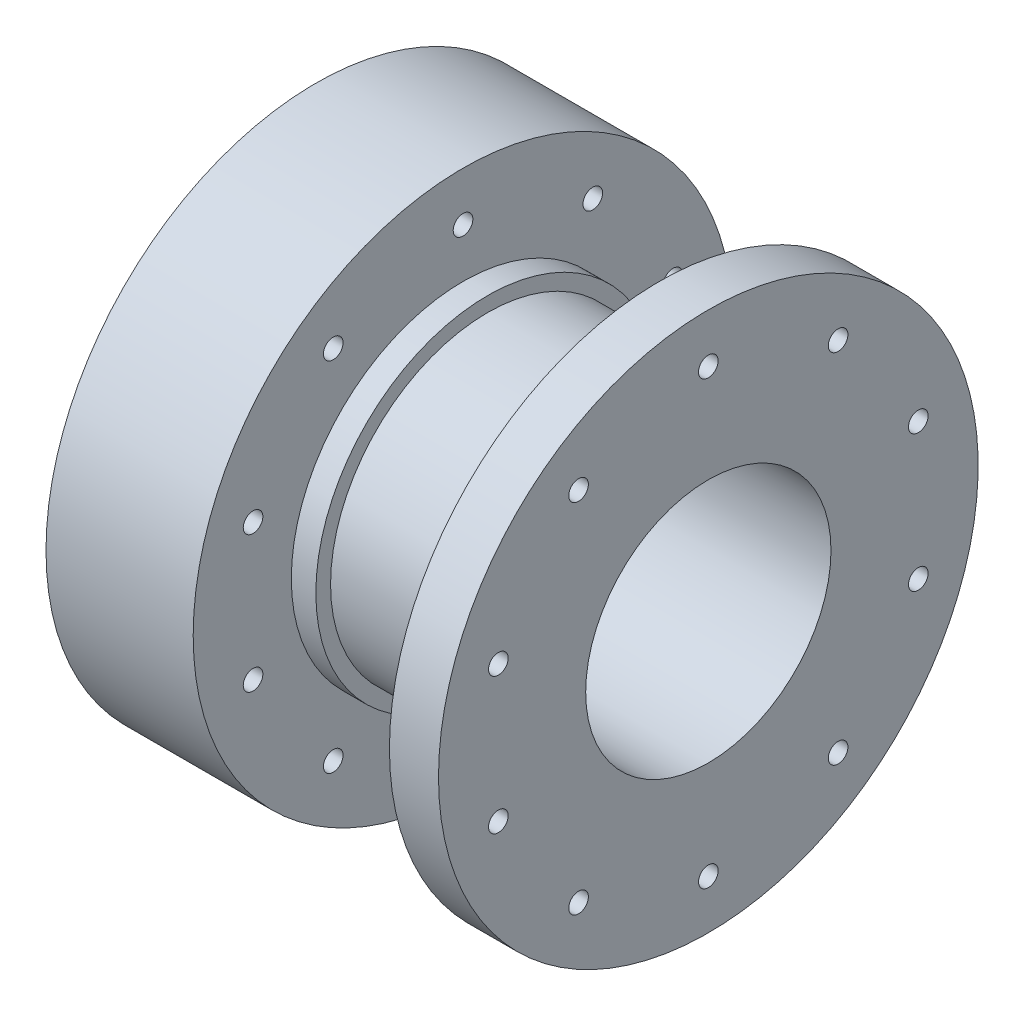
ISO-10303-21;
HEADER;
FILE_DESCRIPTION(('STEP AP214'),'2;1');
FILE_NAME('part.step','',(''),(''),'','','');
FILE_SCHEMA(('AUTOMOTIVE_DESIGN { 1 0 10303 214 1 1 1 1 }'));
ENDSEC;
DATA;
#1=APPLICATION_CONTEXT('core data for automotive mechanical design processes');
#2=APPLICATION_PROTOCOL_DEFINITION('international standard','automotive_design',2000,#1);
#3=PRODUCT_CONTEXT('',#1,'mechanical');
#4=PRODUCT('Part','Part','',(#3));
#5=PRODUCT_RELATED_PRODUCT_CATEGORY('part','',(#4));
#6=PRODUCT_DEFINITION_FORMATION('','',#4);
#7=PRODUCT_DEFINITION_CONTEXT('part definition',#1,'design');
#8=PRODUCT_DEFINITION('design','',#6,#7);
#9=PRODUCT_DEFINITION_SHAPE('','',#8);
#10=(LENGTH_UNIT() NAMED_UNIT(*) SI_UNIT(.MILLI.,.METRE.));
#11=(NAMED_UNIT(*) PLANE_ANGLE_UNIT() SI_UNIT($,.RADIAN.));
#12=(NAMED_UNIT(*) SI_UNIT($,.STERADIAN.) SOLID_ANGLE_UNIT());
#13=UNCERTAINTY_MEASURE_WITH_UNIT(LENGTH_MEASURE(1.E-05),#10,'distance_accuracy_value','');
#14=(GEOMETRIC_REPRESENTATION_CONTEXT(3) GLOBAL_UNCERTAINTY_ASSIGNED_CONTEXT((#13)) GLOBAL_UNIT_ASSIGNED_CONTEXT((#10,
#11,#12)) REPRESENTATION_CONTEXT('',''));
#15=CARTESIAN_POINT('',(0.,0.,0.));
#16=DIRECTION('',(0.,0.,1.));
#17=DIRECTION('',(1.,0.,0.));
#18=AXIS2_PLACEMENT_3D('',#15,#16,#17);
#19=CARTESIAN_POINT('',(-97.552258709785,0.,0.));
#20=DIRECTION('',(-1.,0.,0.));
#21=DIRECTION('',(0.,0.,1.));
#22=AXIS2_PLACEMENT_3D('',#19,#20,#21);
#23=CYLINDRICAL_SURFACE('',#22,40.);
#24=CARTESIAN_POINT('',(-50.,0.,0.));
#25=DIRECTION('',(-1.,0.,0.));
#26=DIRECTION('',(0.,0.,1.));
#27=AXIS2_PLACEMENT_3D('',#24,#25,#26);
#28=CIRCLE('',#27,40.);
#29=CARTESIAN_POINT('',(-50.,0.,40.));
#30=VERTEX_POINT('',#29);
#31=EDGE_CURVE('E10',#30,#30,#28,.T.);
#32=ORIENTED_EDGE('',*,*,#31,.F.);
#33=EDGE_LOOP('',(#32));
#34=FACE_BOUND('',#33,.T.);
#35=CARTESIAN_POINT('',(-30.,0.,0.));
#36=DIRECTION('',(-1.,0.,0.));
#37=DIRECTION('',(0.,0.,1.));
#38=AXIS2_PLACEMENT_3D('',#35,#36,#37);
#39=CIRCLE('',#38,40.);
#40=CARTESIAN_POINT('',(-30.,0.,40.));
#41=VERTEX_POINT('',#40);
#42=EDGE_CURVE('E117',#41,#41,#39,.T.);
#43=ORIENTED_EDGE('',*,*,#42,.T.);
#44=EDGE_LOOP('',(#43));
#45=FACE_BOUND('',#44,.T.);
#46=ADVANCED_FACE('F37',(#34,#45),#23,.T.);
#47=CARTESIAN_POINT('',(-50.,35.,0.));
#48=DIRECTION('',(1.,0.,0.));
#49=DIRECTION('',(0.,0.,-1.));
#50=AXIS2_PLACEMENT_3D('',#47,#48,#49);
#51=PLANE('',#50);
#52=CARTESIAN_POINT('',(-50.,0.,0.));
#53=DIRECTION('',(-1.,0.,0.));
#54=DIRECTION('',(0.,0.,1.));
#55=AXIS2_PLACEMENT_3D('',#52,#53,#54);
#56=CIRCLE('',#55,35.);
#57=CARTESIAN_POINT('',(-50.,0.,35.));
#58=VERTEX_POINT('',#57);
#59=EDGE_CURVE('E44',#58,#58,#56,.T.);
#60=ORIENTED_EDGE('',*,*,#59,.F.);
#61=EDGE_LOOP('',(#60));
#62=FACE_BOUND('',#61,.T.);
#63=ORIENTED_EDGE('',*,*,#31,.T.);
#64=EDGE_LOOP('',(#63));
#65=FACE_BOUND('',#64,.T.);
#66=ADVANCED_FACE('F169',(#62,#65),#51,.F.);
#67=CARTESIAN_POINT('',(-97.552258709785,0.,0.));
#68=DIRECTION('',(-1.,0.,0.));
#69=DIRECTION('',(0.,0.,1.));
#70=AXIS2_PLACEMENT_3D('',#67,#68,#69);
#71=CYLINDRICAL_SURFACE('',#70,35.);
#72=CARTESIAN_POINT('',(-30.,0.,0.));
#73=DIRECTION('',(-1.,0.,0.));
#74=DIRECTION('',(0.,0.,1.));
#75=AXIS2_PLACEMENT_3D('',#72,#73,#74);
#76=CIRCLE('',#75,35.);
#77=CARTESIAN_POINT('',(-30.,0.,35.));
#78=VERTEX_POINT('',#77);
#79=EDGE_CURVE('E49',#78,#78,#76,.T.);
#80=ORIENTED_EDGE('',*,*,#79,.F.);
#81=EDGE_LOOP('',(#80));
#82=FACE_BOUND('',#81,.T.);
#83=ORIENTED_EDGE('',*,*,#59,.T.);
#84=EDGE_LOOP('',(#83));
#85=FACE_BOUND('',#84,.T.);
#86=ADVANCED_FACE('F166',(#82,#85),#71,.F.);
#87=CARTESIAN_POINT('',(-30.,25.,0.));
#88=DIRECTION('',(1.,0.,0.));
#89=DIRECTION('',(0.,0.,-1.));
#90=AXIS2_PLACEMENT_3D('',#87,#88,#89);
#91=PLANE('',#90);
#92=CARTESIAN_POINT('',(-30.,0.,0.));
#93=DIRECTION('',(-1.,0.,0.));
#94=DIRECTION('',(0.,0.,1.));
#95=AXIS2_PLACEMENT_3D('',#92,#93,#94);
#96=CIRCLE('',#95,25.);
#97=CARTESIAN_POINT('',(-30.,0.,25.));
#98=VERTEX_POINT('',#97);
#99=EDGE_CURVE('E159',#98,#98,#96,.T.);
#100=ORIENTED_EDGE('',*,*,#99,.F.);
#101=EDGE_LOOP('',(#100));
#102=FACE_BOUND('',#101,.T.);
#103=ORIENTED_EDGE('',*,*,#79,.T.);
#104=EDGE_LOOP('',(#103));
#105=FACE_BOUND('',#104,.T.);
#106=ADVANCED_FACE('F164',(#102,#105),#91,.F.);
#107=CARTESIAN_POINT('',(-97.552258709785,0.,0.));
#108=DIRECTION('',(-1.,0.,0.));
#109=DIRECTION('',(0.,0.,1.));
#110=AXIS2_PLACEMENT_3D('',#107,#108,#109);
#111=CYLINDRICAL_SURFACE('',#110,25.);
#112=CARTESIAN_POINT('',(30.,0.,0.));
#113=DIRECTION('',(-1.,0.,0.));
#114=DIRECTION('',(0.,0.,1.));
#115=AXIS2_PLACEMENT_3D('',#112,#113,#114);
#116=CIRCLE('',#115,25.);
#117=CARTESIAN_POINT('',(30.,0.,25.));
#118=VERTEX_POINT('',#117);
#119=EDGE_CURVE('E156',#118,#118,#116,.T.);
#120=ORIENTED_EDGE('',*,*,#119,.F.);
#121=EDGE_LOOP('',(#120));
#122=FACE_BOUND('',#121,.T.);
#123=ORIENTED_EDGE('',*,*,#99,.T.);
#124=EDGE_LOOP('',(#123));
#125=FACE_BOUND('',#124,.T.);
#126=ADVANCED_FACE('F181',(#122,#125),#111,.F.);
#127=CARTESIAN_POINT('',(30.,55.,0.));
#128=DIRECTION('',(-1.,0.,0.));
#129=DIRECTION('',(0.,0.,1.));
#130=AXIS2_PLACEMENT_3D('',#127,#128,#129);
#131=PLANE('',#130);
#132=CARTESIAN_POINT('',(30.,13.9057647468731,42.7975432332818));
#133=DIRECTION('',(1.,0.,0.));
#134=DIRECTION('',(0.,0.,-1.));
#135=AXIS2_PLACEMENT_3D('',#132,#133,#134);
#136=CIRCLE('',#135,2.);
#137=CARTESIAN_POINT('',(30.,13.9057647468731,40.7975432332818));
#138=VERTEX_POINT('',#137);
#139=EDGE_CURVE('E376',#138,#138,#136,.T.);
#140=ORIENTED_EDGE('',*,*,#139,.F.);
#141=EDGE_LOOP('',(#140));
#142=FACE_BOUND('',#141,.T.);
#143=CARTESIAN_POINT('',(30.,-13.9057647468722,42.797543233282));
#144=DIRECTION('',(1.,0.,0.));
#145=DIRECTION('',(0.,0.,-1.));
#146=AXIS2_PLACEMENT_3D('',#143,#144,#145);
#147=CIRCLE('',#146,2.);
#148=CARTESIAN_POINT('',(30.,-13.9057647468722,40.797543233282));
#149=VERTEX_POINT('',#148);
#150=EDGE_CURVE('E379',#149,#149,#147,.T.);
#151=ORIENTED_EDGE('',*,*,#150,.F.);
#152=EDGE_LOOP('',(#151));
#153=FACE_BOUND('',#152,.T.);
#154=CARTESIAN_POINT('',(30.,-36.4057647468724,26.4503363531616));
#155=DIRECTION('',(1.,0.,0.));
#156=DIRECTION('',(0.,0.,-1.));
#157=AXIS2_PLACEMENT_3D('',#154,#155,#156);
#158=CIRCLE('',#157,2.);
#159=CARTESIAN_POINT('',(30.,-36.4057647468724,24.4503363531616));
#160=VERTEX_POINT('',#159);
#161=EDGE_CURVE('E383',#160,#160,#158,.T.);
#162=ORIENTED_EDGE('',*,*,#161,.F.);
#163=EDGE_LOOP('',(#162));
#164=FACE_BOUND('',#163,.T.);
#165=CARTESIAN_POINT('',(30.,-45.,3.14233320495882E-13));
#166=DIRECTION('',(1.,0.,0.));
#167=DIRECTION('',(0.,0.,-1.));
#168=AXIS2_PLACEMENT_3D('',#165,#166,#167);
#169=CIRCLE('',#168,2.);
#170=CARTESIAN_POINT('',(30.,-45.,-1.99999999999969));
#171=VERTEX_POINT('',#170);
#172=EDGE_CURVE('E368',#171,#171,#169,.T.);
#173=ORIENTED_EDGE('',*,*,#172,.F.);
#174=EDGE_LOOP('',(#173));
#175=FACE_BOUND('',#174,.T.);
#176=CARTESIAN_POINT('',(30.,-36.4057647468728,-26.4503363531611));
#177=DIRECTION('',(1.,0.,0.));
#178=DIRECTION('',(0.,0.,-1.));
#179=AXIS2_PLACEMENT_3D('',#176,#177,#178);
#180=CIRCLE('',#179,2.);
#181=CARTESIAN_POINT('',(30.,-36.4057647468728,-28.4503363531611));
#182=VERTEX_POINT('',#181);
#183=EDGE_CURVE('E364',#182,#182,#180,.T.);
#184=ORIENTED_EDGE('',*,*,#183,.F.);
#185=EDGE_LOOP('',(#184));
#186=FACE_BOUND('',#185,.T.);
#187=CARTESIAN_POINT('',(30.,-13.9057647468728,-42.7975432332819));
#188=DIRECTION('',(1.,0.,0.));
#189=DIRECTION('',(0.,0.,-1.));
#190=AXIS2_PLACEMENT_3D('',#187,#188,#189);
#191=CIRCLE('',#190,2.);
#192=CARTESIAN_POINT('',(30.,-13.9057647468728,-44.7975432332819));
#193=VERTEX_POINT('',#192);
#194=EDGE_CURVE('E367',#193,#193,#191,.T.);
#195=ORIENTED_EDGE('',*,*,#194,.F.);
#196=EDGE_LOOP('',(#195));
#197=FACE_BOUND('',#196,.T.);
#198=CARTESIAN_POINT('',(30.,45.,0.));
#199=DIRECTION('',(1.,0.,0.));
#200=DIRECTION('',(0.,0.,-1.));
#201=AXIS2_PLACEMENT_3D('',#198,#199,#200);
#202=CIRCLE('',#201,2.);
#203=CARTESIAN_POINT('',(30.,45.,-2.));
#204=VERTEX_POINT('',#203);
#205=EDGE_CURVE('E371',#204,#204,#202,.T.);
#206=ORIENTED_EDGE('',*,*,#205,.F.);
#207=EDGE_LOOP('',(#206));
#208=FACE_BOUND('',#207,.T.);
#209=CARTESIAN_POINT('',(30.,13.9057647468725,-42.797543233282));
#210=DIRECTION('',(1.,0.,0.));
#211=DIRECTION('',(0.,0.,-1.));
#212=AXIS2_PLACEMENT_3D('',#209,#210,#211);
#213=CIRCLE('',#212,2.);
#214=CARTESIAN_POINT('',(30.,13.9057647468725,-44.797543233282));
#215=VERTEX_POINT('',#214);
#216=EDGE_CURVE('E363',#215,#215,#213,.T.);
#217=ORIENTED_EDGE('',*,*,#216,.F.);
#218=EDGE_LOOP('',(#217));
#219=FACE_BOUND('',#218,.T.);
#220=CARTESIAN_POINT('',(30.,36.405764746873,26.4503363531608));
#221=DIRECTION('',(1.,0.,0.));
#222=DIRECTION('',(0.,0.,-1.));
#223=AXIS2_PLACEMENT_3D('',#220,#221,#222);
#224=CIRCLE('',#223,2.);
#225=CARTESIAN_POINT('',(30.,36.405764746873,24.4503363531608));
#226=VERTEX_POINT('',#225);
#227=EDGE_CURVE('E380',#226,#226,#224,.T.);
#228=ORIENTED_EDGE('',*,*,#227,.F.);
#229=EDGE_LOOP('',(#228));
#230=FACE_BOUND('',#229,.T.);
#231=CARTESIAN_POINT('',(30.,36.4057647468726,-26.4503363531613));
#232=DIRECTION('',(1.,0.,0.));
#233=DIRECTION('',(0.,0.,-1.));
#234=AXIS2_PLACEMENT_3D('',#231,#232,#233);
#235=CIRCLE('',#234,2.);
#236=CARTESIAN_POINT('',(30.,36.4057647468726,-28.4503363531613));
#237=VERTEX_POINT('',#236);
#238=EDGE_CURVE('E57',#237,#237,#235,.T.);
#239=ORIENTED_EDGE('',*,*,#238,.F.);
#240=EDGE_LOOP('',(#239));
#241=FACE_BOUND('',#240,.T.);
#242=CARTESIAN_POINT('',(30.,0.,0.));
#243=DIRECTION('',(-1.,0.,0.));
#244=DIRECTION('',(0.,0.,1.));
#245=AXIS2_PLACEMENT_3D('',#242,#243,#244);
#246=CIRCLE('',#245,55.);
#247=CARTESIAN_POINT('',(30.,0.,55.));
#248=VERTEX_POINT('',#247);
#249=EDGE_CURVE('E153',#248,#248,#246,.T.);
#250=ORIENTED_EDGE('',*,*,#249,.F.);
#251=EDGE_LOOP('',(#250));
#252=FACE_BOUND('',#251,.T.);
#253=ORIENTED_EDGE('',*,*,#119,.T.);
#254=EDGE_LOOP('',(#253));
#255=FACE_BOUND('',#254,.T.);
#256=ADVANCED_FACE('F185',(#142,#153,#164,#175,#186,#197,#208,#219,#230,#241,#252,#255),#131,.F.);
#257=CARTESIAN_POINT('',(-97.552258709785,0.,0.));
#258=DIRECTION('',(-1.,0.,0.));
#259=DIRECTION('',(0.,0.,1.));
#260=AXIS2_PLACEMENT_3D('',#257,#258,#259);
#261=CYLINDRICAL_SURFACE('',#260,55.);
#262=CARTESIAN_POINT('',(20.,0.,0.));
#263=DIRECTION('',(-1.,0.,0.));
#264=DIRECTION('',(0.,0.,1.));
#265=AXIS2_PLACEMENT_3D('',#262,#263,#264);
#266=CIRCLE('',#265,55.);
#267=CARTESIAN_POINT('',(20.,0.,55.));
#268=VERTEX_POINT('',#267);
#269=EDGE_CURVE('E150',#268,#268,#266,.T.);
#270=ORIENTED_EDGE('',*,*,#269,.F.);
#271=EDGE_LOOP('',(#270));
#272=FACE_BOUND('',#271,.T.);
#273=ORIENTED_EDGE('',*,*,#249,.T.);
#274=EDGE_LOOP('',(#273));
#275=FACE_BOUND('',#274,.T.);
#276=ADVANCED_FACE('F189',(#272,#275),#261,.T.);
#277=CARTESIAN_POINT('',(20.,35.,0.));
#278=DIRECTION('',(1.,0.,0.));
#279=DIRECTION('',(0.,0.,-1.));
#280=AXIS2_PLACEMENT_3D('',#277,#278,#279);
#281=PLANE('',#280);
#282=CARTESIAN_POINT('',(20.,13.9057647468731,42.7975432332818));
#283=DIRECTION('',(1.,0.,0.));
#284=DIRECTION('',(0.,0.,-1.));
#285=AXIS2_PLACEMENT_3D('',#282,#283,#284);
#286=CIRCLE('',#285,2.);
#287=CARTESIAN_POINT('',(20.,13.9057647468731,40.7975432332818));
#288=VERTEX_POINT('',#287);
#289=EDGE_CURVE('E114',#288,#288,#286,.T.);
#290=ORIENTED_EDGE('',*,*,#289,.T.);
#291=EDGE_LOOP('',(#290));
#292=FACE_BOUND('',#291,.T.);
#293=CARTESIAN_POINT('',(20.,-13.9057647468722,42.797543233282));
#294=DIRECTION('',(1.,0.,0.));
#295=DIRECTION('',(0.,0.,-1.));
#296=AXIS2_PLACEMENT_3D('',#293,#294,#295);
#297=CIRCLE('',#296,2.);
#298=CARTESIAN_POINT('',(20.,-13.9057647468722,40.797543233282));
#299=VERTEX_POINT('',#298);
#300=EDGE_CURVE('E99',#299,#299,#297,.T.);
#301=ORIENTED_EDGE('',*,*,#300,.T.);
#302=EDGE_LOOP('',(#301));
#303=FACE_BOUND('',#302,.T.);
#304=CARTESIAN_POINT('',(20.,-36.4057647468724,26.4503363531616));
#305=DIRECTION('',(1.,0.,0.));
#306=DIRECTION('',(0.,0.,-1.));
#307=AXIS2_PLACEMENT_3D('',#304,#305,#306);
#308=CIRCLE('',#307,2.);
#309=CARTESIAN_POINT('',(20.,-36.4057647468724,24.4503363531616));
#310=VERTEX_POINT('',#309);
#311=EDGE_CURVE('E95',#310,#310,#308,.T.);
#312=ORIENTED_EDGE('',*,*,#311,.T.);
#313=EDGE_LOOP('',(#312));
#314=FACE_BOUND('',#313,.T.);
#315=CARTESIAN_POINT('',(20.,-45.,3.14233320495882E-13));
#316=DIRECTION('',(1.,0.,0.));
#317=DIRECTION('',(0.,0.,-1.));
#318=AXIS2_PLACEMENT_3D('',#315,#316,#317);
#319=CIRCLE('',#318,2.);
#320=CARTESIAN_POINT('',(20.,-45.,-1.99999999999969));
#321=VERTEX_POINT('',#320);
#322=EDGE_CURVE('E91',#321,#321,#319,.T.);
#323=ORIENTED_EDGE('',*,*,#322,.T.);
#324=EDGE_LOOP('',(#323));
#325=FACE_BOUND('',#324,.T.);
#326=CARTESIAN_POINT('',(20.,-36.4057647468728,-26.4503363531611));
#327=DIRECTION('',(1.,0.,0.));
#328=DIRECTION('',(0.,0.,-1.));
#329=AXIS2_PLACEMENT_3D('',#326,#327,#328);
#330=CIRCLE('',#329,2.);
#331=CARTESIAN_POINT('',(20.,-36.4057647468728,-28.4503363531611));
#332=VERTEX_POINT('',#331);
#333=EDGE_CURVE('E87',#332,#332,#330,.T.);
#334=ORIENTED_EDGE('',*,*,#333,.T.);
#335=EDGE_LOOP('',(#334));
#336=FACE_BOUND('',#335,.T.);
#337=CARTESIAN_POINT('',(20.,-13.9057647468728,-42.7975432332819));
#338=DIRECTION('',(1.,0.,0.));
#339=DIRECTION('',(0.,0.,-1.));
#340=AXIS2_PLACEMENT_3D('',#337,#338,#339);
#341=CIRCLE('',#340,2.);
#342=CARTESIAN_POINT('',(20.,-13.9057647468728,-44.7975432332819));
#343=VERTEX_POINT('',#342);
#344=EDGE_CURVE('E82',#343,#343,#341,.T.);
#345=ORIENTED_EDGE('',*,*,#344,.T.);
#346=EDGE_LOOP('',(#345));
#347=FACE_BOUND('',#346,.T.);
#348=CARTESIAN_POINT('',(20.,45.,0.));
#349=DIRECTION('',(1.,0.,0.));
#350=DIRECTION('',(0.,0.,-1.));
#351=AXIS2_PLACEMENT_3D('',#348,#349,#350);
#352=CIRCLE('',#351,2.);
#353=CARTESIAN_POINT('',(20.,45.,-2.));
#354=VERTEX_POINT('',#353);
#355=EDGE_CURVE('E77',#354,#354,#352,.T.);
#356=ORIENTED_EDGE('',*,*,#355,.T.);
#357=EDGE_LOOP('',(#356));
#358=FACE_BOUND('',#357,.T.);
#359=CARTESIAN_POINT('',(20.,13.9057647468725,-42.797543233282));
#360=DIRECTION('',(1.,0.,0.));
#361=DIRECTION('',(0.,0.,-1.));
#362=AXIS2_PLACEMENT_3D('',#359,#360,#361);
#363=CIRCLE('',#362,2.);
#364=CARTESIAN_POINT('',(20.,13.9057647468725,-44.797543233282));
#365=VERTEX_POINT('',#364);
#366=EDGE_CURVE('E72',#365,#365,#363,.T.);
#367=ORIENTED_EDGE('',*,*,#366,.T.);
#368=EDGE_LOOP('',(#367));
#369=FACE_BOUND('',#368,.T.);
#370=CARTESIAN_POINT('',(20.,36.405764746873,26.4503363531608));
#371=DIRECTION('',(1.,0.,0.));
#372=DIRECTION('',(0.,0.,-1.));
#373=AXIS2_PLACEMENT_3D('',#370,#371,#372);
#374=CIRCLE('',#373,2.);
#375=CARTESIAN_POINT('',(20.,36.405764746873,24.4503363531608));
#376=VERTEX_POINT('',#375);
#377=EDGE_CURVE('E67',#376,#376,#374,.T.);
#378=ORIENTED_EDGE('',*,*,#377,.T.);
#379=EDGE_LOOP('',(#378));
#380=FACE_BOUND('',#379,.T.);
#381=CARTESIAN_POINT('',(20.,36.4057647468726,-26.4503363531613));
#382=DIRECTION('',(1.,0.,0.));
#383=DIRECTION('',(0.,0.,-1.));
#384=AXIS2_PLACEMENT_3D('',#381,#382,#383);
#385=CIRCLE('',#384,2.);
#386=CARTESIAN_POINT('',(20.,36.4057647468726,-28.4503363531613));
#387=VERTEX_POINT('',#386);
#388=EDGE_CURVE('E62',#387,#387,#385,.T.);
#389=ORIENTED_EDGE('',*,*,#388,.T.);
#390=EDGE_LOOP('',(#389));
#391=FACE_BOUND('',#390,.T.);
#392=CARTESIAN_POINT('',(20.,0.,0.));
#393=DIRECTION('',(-1.,0.,0.));
#394=DIRECTION('',(0.,0.,1.));
#395=AXIS2_PLACEMENT_3D('',#392,#393,#394);
#396=CIRCLE('',#395,35.);
#397=CARTESIAN_POINT('',(20.,0.,35.));
#398=VERTEX_POINT('',#397);
#399=EDGE_CURVE('E147',#398,#398,#396,.T.);
#400=ORIENTED_EDGE('',*,*,#399,.F.);
#401=EDGE_LOOP('',(#400));
#402=FACE_BOUND('',#401,.T.);
#403=ORIENTED_EDGE('',*,*,#269,.T.);
#404=EDGE_LOOP('',(#403));
#405=FACE_BOUND('',#404,.T.);
#406=ADVANCED_FACE('F193',(#292,#303,#314,#325,#336,#347,#358,#369,#380,#391,#402,#405),#281,.F.);
#407=CARTESIAN_POINT('',(-97.552258709785,0.,0.));
#408=DIRECTION('',(-1.,0.,0.));
#409=DIRECTION('',(0.,0.,1.));
#410=AXIS2_PLACEMENT_3D('',#407,#408,#409);
#411=CYLINDRICAL_SURFACE('',#410,35.);
#412=CARTESIAN_POINT('',(15.,0.,0.));
#413=DIRECTION('',(-1.,0.,0.));
#414=DIRECTION('',(0.,0.,1.));
#415=AXIS2_PLACEMENT_3D('',#412,#413,#414);
#416=CIRCLE('',#415,35.);
#417=CARTESIAN_POINT('',(15.,0.,35.));
#418=VERTEX_POINT('',#417);
#419=EDGE_CURVE('E144',#418,#418,#416,.T.);
#420=ORIENTED_EDGE('',*,*,#419,.F.);
#421=EDGE_LOOP('',(#420));
#422=FACE_BOUND('',#421,.T.);
#423=ORIENTED_EDGE('',*,*,#399,.T.);
#424=EDGE_LOOP('',(#423));
#425=FACE_BOUND('',#424,.T.);
#426=ADVANCED_FACE('F197',(#422,#425),#411,.T.);
#427=CARTESIAN_POINT('',(15.,32.,0.));
#428=DIRECTION('',(1.,0.,0.));
#429=DIRECTION('',(0.,0.,-1.));
#430=AXIS2_PLACEMENT_3D('',#427,#428,#429);
#431=PLANE('',#430);
#432=CARTESIAN_POINT('',(15.,0.,0.));
#433=DIRECTION('',(-1.,0.,0.));
#434=DIRECTION('',(0.,0.,1.));
#435=AXIS2_PLACEMENT_3D('',#432,#433,#434);
#436=CIRCLE('',#435,32.);
#437=CARTESIAN_POINT('',(15.,0.,32.));
#438=VERTEX_POINT('',#437);
#439=EDGE_CURVE('E141',#438,#438,#436,.T.);
#440=ORIENTED_EDGE('',*,*,#439,.F.);
#441=EDGE_LOOP('',(#440));
#442=FACE_BOUND('',#441,.T.);
#443=ORIENTED_EDGE('',*,*,#419,.T.);
#444=EDGE_LOOP('',(#443));
#445=FACE_BOUND('',#444,.T.);
#446=ADVANCED_FACE('F201',(#442,#445),#431,.F.);
#447=CARTESIAN_POINT('',(-97.552258709785,0.,0.));
#448=DIRECTION('',(-1.,0.,0.));
#449=DIRECTION('',(0.,0.,1.));
#450=AXIS2_PLACEMENT_3D('',#447,#448,#449);
#451=CYLINDRICAL_SURFACE('',#450,32.);
#452=CARTESIAN_POINT('',(-15.,0.,0.));
#453=DIRECTION('',(-1.,0.,0.));
#454=DIRECTION('',(0.,0.,1.));
#455=AXIS2_PLACEMENT_3D('',#452,#453,#454);
#456=CIRCLE('',#455,32.);
#457=CARTESIAN_POINT('',(-15.,0.,32.));
#458=VERTEX_POINT('',#457);
#459=EDGE_CURVE('E138',#458,#458,#456,.T.);
#460=ORIENTED_EDGE('',*,*,#459,.F.);
#461=EDGE_LOOP('',(#460));
#462=FACE_BOUND('',#461,.T.);
#463=ORIENTED_EDGE('',*,*,#439,.T.);
#464=EDGE_LOOP('',(#463));
#465=FACE_BOUND('',#464,.T.);
#466=ADVANCED_FACE('F205',(#462,#465),#451,.T.);
#467=CARTESIAN_POINT('',(-15.,35.,0.));
#468=DIRECTION('',(-1.,0.,0.));
#469=DIRECTION('',(0.,0.,1.));
#470=AXIS2_PLACEMENT_3D('',#467,#468,#469);
#471=PLANE('',#470);
#472=CARTESIAN_POINT('',(-15.,0.,0.));
#473=DIRECTION('',(-1.,0.,0.));
#474=DIRECTION('',(0.,0.,1.));
#475=AXIS2_PLACEMENT_3D('',#472,#473,#474);
#476=CIRCLE('',#475,35.);
#477=CARTESIAN_POINT('',(-15.,0.,35.));
#478=VERTEX_POINT('',#477);
#479=EDGE_CURVE('E135',#478,#478,#476,.T.);
#480=ORIENTED_EDGE('',*,*,#479,.F.);
#481=EDGE_LOOP('',(#480));
#482=FACE_BOUND('',#481,.T.);
#483=ORIENTED_EDGE('',*,*,#459,.T.);
#484=EDGE_LOOP('',(#483));
#485=FACE_BOUND('',#484,.T.);
#486=ADVANCED_FACE('F209',(#482,#485),#471,.F.);
#487=CARTESIAN_POINT('',(-97.552258709785,0.,0.));
#488=DIRECTION('',(-1.,0.,0.));
#489=DIRECTION('',(0.,0.,1.));
#490=AXIS2_PLACEMENT_3D('',#487,#488,#489);
#491=CYLINDRICAL_SURFACE('',#490,35.);
#492=CARTESIAN_POINT('',(-20.,0.,0.));
#493=DIRECTION('',(-1.,0.,0.));
#494=DIRECTION('',(0.,0.,1.));
#495=AXIS2_PLACEMENT_3D('',#492,#493,#494);
#496=CIRCLE('',#495,35.);
#497=CARTESIAN_POINT('',(-20.,0.,35.));
#498=VERTEX_POINT('',#497);
#499=EDGE_CURVE('E132',#498,#498,#496,.T.);
#500=ORIENTED_EDGE('',*,*,#499,.F.);
#501=EDGE_LOOP('',(#500));
#502=FACE_BOUND('',#501,.T.);
#503=ORIENTED_EDGE('',*,*,#479,.T.);
#504=EDGE_LOOP('',(#503));
#505=FACE_BOUND('',#504,.T.);
#506=ADVANCED_FACE('F213',(#502,#505),#491,.T.);
#507=CARTESIAN_POINT('',(-20.,55.,0.));
#508=DIRECTION('',(-1.,0.,0.));
#509=DIRECTION('',(0.,0.,1.));
#510=AXIS2_PLACEMENT_3D('',#507,#508,#509);
#511=PLANE('',#510);
#512=CARTESIAN_POINT('',(-20.,13.9057647468731,42.7975432332818));
#513=DIRECTION('',(-1.,0.,0.));
#514=DIRECTION('',(0.,0.,1.));
#515=AXIS2_PLACEMENT_3D('',#512,#513,#514);
#516=CIRCLE('',#515,2.);
#517=CARTESIAN_POINT('',(-20.,13.9057647468731,44.7975432332818));
#518=VERTEX_POINT('',#517);
#519=EDGE_CURVE('E111',#518,#518,#516,.T.);
#520=ORIENTED_EDGE('',*,*,#519,.T.);
#521=EDGE_LOOP('',(#520));
#522=FACE_BOUND('',#521,.T.);
#523=CARTESIAN_POINT('',(-20.,-13.9057647468722,42.797543233282));
#524=DIRECTION('',(-1.,0.,0.));
#525=DIRECTION('',(0.,0.,1.));
#526=AXIS2_PLACEMENT_3D('',#523,#524,#525);
#527=CIRCLE('',#526,2.);
#528=CARTESIAN_POINT('',(-20.,-13.9057647468722,44.797543233282));
#529=VERTEX_POINT('',#528);
#530=EDGE_CURVE('E94',#529,#529,#527,.T.);
#531=ORIENTED_EDGE('',*,*,#530,.T.);
#532=EDGE_LOOP('',(#531));
#533=FACE_BOUND('',#532,.T.);
#534=CARTESIAN_POINT('',(-20.,-36.4057647468724,26.4503363531616));
#535=DIRECTION('',(-1.,0.,0.));
#536=DIRECTION('',(0.,0.,1.));
#537=AXIS2_PLACEMENT_3D('',#534,#535,#536);
#538=CIRCLE('',#537,2.);
#539=CARTESIAN_POINT('',(-20.,-36.4057647468724,28.4503363531616));
#540=VERTEX_POINT('',#539);
#541=EDGE_CURVE('E90',#540,#540,#538,.T.);
#542=ORIENTED_EDGE('',*,*,#541,.T.);
#543=EDGE_LOOP('',(#542));
#544=FACE_BOUND('',#543,.T.);
#545=CARTESIAN_POINT('',(-20.,-45.,3.14233320495882E-13));
#546=DIRECTION('',(-1.,0.,0.));
#547=DIRECTION('',(0.,0.,1.));
#548=AXIS2_PLACEMENT_3D('',#545,#546,#547);
#549=CIRCLE('',#548,2.);
#550=CARTESIAN_POINT('',(-20.,-45.,2.00000000000032));
#551=VERTEX_POINT('',#550);
#552=EDGE_CURVE('E86',#551,#551,#549,.T.);
#553=ORIENTED_EDGE('',*,*,#552,.T.);
#554=EDGE_LOOP('',(#553));
#555=FACE_BOUND('',#554,.T.);
#556=CARTESIAN_POINT('',(-20.,-36.4057647468728,-26.4503363531611));
#557=DIRECTION('',(-1.,0.,0.));
#558=DIRECTION('',(0.,0.,1.));
#559=AXIS2_PLACEMENT_3D('',#556,#557,#558);
#560=CIRCLE('',#559,2.);
#561=CARTESIAN_POINT('',(-20.,-36.4057647468728,-24.4503363531611));
#562=VERTEX_POINT('',#561);
#563=EDGE_CURVE('E81',#562,#562,#560,.T.);
#564=ORIENTED_EDGE('',*,*,#563,.T.);
#565=EDGE_LOOP('',(#564));
#566=FACE_BOUND('',#565,.T.);
#567=CARTESIAN_POINT('',(-20.,-13.9057647468728,-42.7975432332819));
#568=DIRECTION('',(-1.,0.,0.));
#569=DIRECTION('',(0.,0.,1.));
#570=AXIS2_PLACEMENT_3D('',#567,#568,#569);
#571=CIRCLE('',#570,2.);
#572=CARTESIAN_POINT('',(-20.,-13.9057647468728,-40.7975432332819));
#573=VERTEX_POINT('',#572);
#574=EDGE_CURVE('E76',#573,#573,#571,.T.);
#575=ORIENTED_EDGE('',*,*,#574,.T.);
#576=EDGE_LOOP('',(#575));
#577=FACE_BOUND('',#576,.T.);
#578=CARTESIAN_POINT('',(-20.,45.,0.));
#579=DIRECTION('',(-1.,0.,0.));
#580=DIRECTION('',(0.,0.,1.));
#581=AXIS2_PLACEMENT_3D('',#578,#579,#580);
#582=CIRCLE('',#581,2.);
#583=CARTESIAN_POINT('',(-20.,45.,2.));
#584=VERTEX_POINT('',#583);
#585=EDGE_CURVE('E71',#584,#584,#582,.T.);
#586=ORIENTED_EDGE('',*,*,#585,.T.);
#587=EDGE_LOOP('',(#586));
#588=FACE_BOUND('',#587,.T.);
#589=CARTESIAN_POINT('',(-20.,13.9057647468725,-42.797543233282));
#590=DIRECTION('',(-1.,0.,0.));
#591=DIRECTION('',(0.,0.,1.));
#592=AXIS2_PLACEMENT_3D('',#589,#590,#591);
#593=CIRCLE('',#592,2.);
#594=CARTESIAN_POINT('',(-20.,13.9057647468725,-40.797543233282));
#595=VERTEX_POINT('',#594);
#596=EDGE_CURVE('E66',#595,#595,#593,.T.);
#597=ORIENTED_EDGE('',*,*,#596,.T.);
#598=EDGE_LOOP('',(#597));
#599=FACE_BOUND('',#598,.T.);
#600=CARTESIAN_POINT('',(-20.,36.405764746873,26.4503363531608));
#601=DIRECTION('',(-1.,0.,0.));
#602=DIRECTION('',(0.,0.,1.));
#603=AXIS2_PLACEMENT_3D('',#600,#601,#602);
#604=CIRCLE('',#603,2.);
#605=CARTESIAN_POINT('',(-20.,36.405764746873,28.4503363531608));
#606=VERTEX_POINT('',#605);
#607=EDGE_CURVE('E61',#606,#606,#604,.T.);
#608=ORIENTED_EDGE('',*,*,#607,.T.);
#609=EDGE_LOOP('',(#608));
#610=FACE_BOUND('',#609,.T.);
#611=CARTESIAN_POINT('',(-20.,36.4057647468726,-26.4503363531613));
#612=DIRECTION('',(-1.,0.,0.));
#613=DIRECTION('',(0.,0.,1.));
#614=AXIS2_PLACEMENT_3D('',#611,#612,#613);
#615=CIRCLE('',#614,2.);
#616=CARTESIAN_POINT('',(-20.,36.4057647468726,-24.4503363531613));
#617=VERTEX_POINT('',#616);
#618=EDGE_CURVE('E56',#617,#617,#615,.T.);
#619=ORIENTED_EDGE('',*,*,#618,.T.);
#620=EDGE_LOOP('',(#619));
#621=FACE_BOUND('',#620,.T.);
#622=CARTESIAN_POINT('',(-20.,0.,0.));
#623=DIRECTION('',(-1.,0.,0.));
#624=DIRECTION('',(0.,0.,1.));
#625=AXIS2_PLACEMENT_3D('',#622,#623,#624);
#626=CIRCLE('',#625,55.);
#627=CARTESIAN_POINT('',(-20.,0.,55.));
#628=VERTEX_POINT('',#627);
#629=EDGE_CURVE('E129',#628,#628,#626,.T.);
#630=ORIENTED_EDGE('',*,*,#629,.F.);
#631=EDGE_LOOP('',(#630));
#632=FACE_BOUND('',#631,.T.);
#633=ORIENTED_EDGE('',*,*,#499,.T.);
#634=EDGE_LOOP('',(#633));
#635=FACE_BOUND('',#634,.T.);
#636=ADVANCED_FACE('F217',(#522,#533,#544,#555,#566,#577,#588,#599,#610,#621,#632,#635),#511,.F.);
#637=CARTESIAN_POINT('',(-97.552258709785,0.,0.));
#638=DIRECTION('',(-1.,0.,0.));
#639=DIRECTION('',(0.,0.,1.));
#640=AXIS2_PLACEMENT_3D('',#637,#638,#639);
#641=CYLINDRICAL_SURFACE('',#640,55.);
#642=CARTESIAN_POINT('',(-50.,0.,0.));
#643=DIRECTION('',(-1.,0.,0.));
#644=DIRECTION('',(0.,0.,1.));
#645=AXIS2_PLACEMENT_3D('',#642,#643,#644);
#646=CIRCLE('',#645,55.);
#647=CARTESIAN_POINT('',(-50.,0.,55.));
#648=VERTEX_POINT('',#647);
#649=EDGE_CURVE('E126',#648,#648,#646,.T.);
#650=ORIENTED_EDGE('',*,*,#649,.F.);
#651=EDGE_LOOP('',(#650));
#652=FACE_BOUND('',#651,.T.);
#653=ORIENTED_EDGE('',*,*,#629,.T.);
#654=EDGE_LOOP('',(#653));
#655=FACE_BOUND('',#654,.T.);
#656=ADVANCED_FACE('F221',(#652,#655),#641,.T.);
#657=CARTESIAN_POINT('',(-50.,50.,0.));
#658=DIRECTION('',(1.,0.,0.));
#659=DIRECTION('',(0.,0.,-1.));
#660=AXIS2_PLACEMENT_3D('',#657,#658,#659);
#661=PLANE('',#660);
#662=CARTESIAN_POINT('',(-50.,0.,0.));
#663=DIRECTION('',(-1.,0.,0.));
#664=DIRECTION('',(0.,0.,1.));
#665=AXIS2_PLACEMENT_3D('',#662,#663,#664);
#666=CIRCLE('',#665,50.);
#667=CARTESIAN_POINT('',(-50.,0.,50.));
#668=VERTEX_POINT('',#667);
#669=EDGE_CURVE('E123',#668,#668,#666,.T.);
#670=ORIENTED_EDGE('',*,*,#669,.F.);
#671=EDGE_LOOP('',(#670));
#672=FACE_BOUND('',#671,.T.);
#673=ORIENTED_EDGE('',*,*,#649,.T.);
#674=EDGE_LOOP('',(#673));
#675=FACE_BOUND('',#674,.T.);
#676=ADVANCED_FACE('F225',(#672,#675),#661,.F.);
#677=CARTESIAN_POINT('',(-97.552258709785,0.,0.));
#678=DIRECTION('',(-1.,0.,0.));
#679=DIRECTION('',(0.,0.,1.));
#680=AXIS2_PLACEMENT_3D('',#677,#678,#679);
#681=CYLINDRICAL_SURFACE('',#680,50.);
#682=CARTESIAN_POINT('',(-30.,0.,0.));
#683=DIRECTION('',(-1.,0.,0.));
#684=DIRECTION('',(0.,0.,1.));
#685=AXIS2_PLACEMENT_3D('',#682,#683,#684);
#686=CIRCLE('',#685,50.);
#687=CARTESIAN_POINT('',(-30.,0.,50.));
#688=VERTEX_POINT('',#687);
#689=EDGE_CURVE('E120',#688,#688,#686,.T.);
#690=ORIENTED_EDGE('',*,*,#689,.F.);
#691=EDGE_LOOP('',(#690));
#692=FACE_BOUND('',#691,.T.);
#693=ORIENTED_EDGE('',*,*,#669,.T.);
#694=EDGE_LOOP('',(#693));
#695=FACE_BOUND('',#694,.T.);
#696=ADVANCED_FACE('F229',(#692,#695),#681,.F.);
#697=CARTESIAN_POINT('',(-30.,40.,0.));
#698=DIRECTION('',(1.,0.,0.));
#699=DIRECTION('',(0.,0.,-1.));
#700=AXIS2_PLACEMENT_3D('',#697,#698,#699);
#701=PLANE('',#700);
#702=CARTESIAN_POINT('',(-30.,13.9057647468731,42.7975432332818));
#703=DIRECTION('',(1.,0.,0.));
#704=DIRECTION('',(0.,0.,-1.));
#705=AXIS2_PLACEMENT_3D('',#702,#703,#704);
#706=CIRCLE('',#705,2.);
#707=CARTESIAN_POINT('',(-30.,13.9057647468731,40.7975432332818));
#708=VERTEX_POINT('',#707);
#709=EDGE_CURVE('E40',#708,#708,#706,.T.);
#710=ORIENTED_EDGE('',*,*,#709,.T.);
#711=EDGE_LOOP('',(#710));
#712=FACE_BOUND('',#711,.T.);
#713=CARTESIAN_POINT('',(-30.,-13.9057647468722,42.797543233282));
#714=DIRECTION('',(1.,0.,0.));
#715=DIRECTION('',(0.,0.,-1.));
#716=AXIS2_PLACEMENT_3D('',#713,#714,#715);
#717=CIRCLE('',#716,2.);
#718=CARTESIAN_POINT('',(-30.,-13.9057647468722,40.797543233282));
#719=VERTEX_POINT('',#718);
#720=EDGE_CURVE('E92',#719,#719,#717,.T.);
#721=ORIENTED_EDGE('',*,*,#720,.T.);
#722=EDGE_LOOP('',(#721));
#723=FACE_BOUND('',#722,.T.);
#724=CARTESIAN_POINT('',(-30.,-36.4057647468724,26.4503363531616));
#725=DIRECTION('',(1.,0.,0.));
#726=DIRECTION('',(0.,0.,-1.));
#727=AXIS2_PLACEMENT_3D('',#724,#725,#726);
#728=CIRCLE('',#727,2.);
#729=CARTESIAN_POINT('',(-30.,-36.4057647468724,24.4503363531616));
#730=VERTEX_POINT('',#729);
#731=EDGE_CURVE('E88',#730,#730,#728,.T.);
#732=ORIENTED_EDGE('',*,*,#731,.T.);
#733=EDGE_LOOP('',(#732));
#734=FACE_BOUND('',#733,.T.);
#735=CARTESIAN_POINT('',(-30.,-45.,3.14233320495882E-13));
#736=DIRECTION('',(1.,0.,0.));
#737=DIRECTION('',(0.,0.,-1.));
#738=AXIS2_PLACEMENT_3D('',#735,#736,#737);
#739=CIRCLE('',#738,2.);
#740=CARTESIAN_POINT('',(-30.,-45.,-1.99999999999969));
#741=VERTEX_POINT('',#740);
#742=EDGE_CURVE('E83',#741,#741,#739,.T.);
#743=ORIENTED_EDGE('',*,*,#742,.T.);
#744=EDGE_LOOP('',(#743));
#745=FACE_BOUND('',#744,.T.);
#746=CARTESIAN_POINT('',(-30.,-36.4057647468728,-26.4503363531611));
#747=DIRECTION('',(1.,0.,0.));
#748=DIRECTION('',(0.,0.,-1.));
#749=AXIS2_PLACEMENT_3D('',#746,#747,#748);
#750=CIRCLE('',#749,2.);
#751=CARTESIAN_POINT('',(-30.,-36.4057647468728,-28.4503363531611));
#752=VERTEX_POINT('',#751);
#753=EDGE_CURVE('E78',#752,#752,#750,.T.);
#754=ORIENTED_EDGE('',*,*,#753,.T.);
#755=EDGE_LOOP('',(#754));
#756=FACE_BOUND('',#755,.T.);
#757=CARTESIAN_POINT('',(-30.,-13.9057647468728,-42.7975432332819));
#758=DIRECTION('',(1.,0.,0.));
#759=DIRECTION('',(0.,0.,-1.));
#760=AXIS2_PLACEMENT_3D('',#757,#758,#759);
#761=CIRCLE('',#760,2.);
#762=CARTESIAN_POINT('',(-30.,-13.9057647468728,-44.7975432332819));
#763=VERTEX_POINT('',#762);
#764=EDGE_CURVE('E73',#763,#763,#761,.T.);
#765=ORIENTED_EDGE('',*,*,#764,.T.);
#766=EDGE_LOOP('',(#765));
#767=FACE_BOUND('',#766,.T.);
#768=CARTESIAN_POINT('',(-30.,45.,0.));
#769=DIRECTION('',(1.,0.,0.));
#770=DIRECTION('',(0.,0.,-1.));
#771=AXIS2_PLACEMENT_3D('',#768,#769,#770);
#772=CIRCLE('',#771,2.);
#773=CARTESIAN_POINT('',(-30.,45.,-2.));
#774=VERTEX_POINT('',#773);
#775=EDGE_CURVE('E68',#774,#774,#772,.T.);
#776=ORIENTED_EDGE('',*,*,#775,.T.);
#777=EDGE_LOOP('',(#776));
#778=FACE_BOUND('',#777,.T.);
#779=CARTESIAN_POINT('',(-30.,13.9057647468725,-42.797543233282));
#780=DIRECTION('',(1.,0.,0.));
#781=DIRECTION('',(0.,0.,-1.));
#782=AXIS2_PLACEMENT_3D('',#779,#780,#781);
#783=CIRCLE('',#782,2.);
#784=CARTESIAN_POINT('',(-30.,13.9057647468725,-44.797543233282));
#785=VERTEX_POINT('',#784);
#786=EDGE_CURVE('E63',#785,#785,#783,.T.);
#787=ORIENTED_EDGE('',*,*,#786,.T.);
#788=EDGE_LOOP('',(#787));
#789=FACE_BOUND('',#788,.T.);
#790=CARTESIAN_POINT('',(-30.,36.405764746873,26.4503363531608));
#791=DIRECTION('',(1.,0.,0.));
#792=DIRECTION('',(0.,0.,-1.));
#793=AXIS2_PLACEMENT_3D('',#790,#791,#792);
#794=CIRCLE('',#793,2.);
#795=CARTESIAN_POINT('',(-30.,36.405764746873,24.4503363531608));
#796=VERTEX_POINT('',#795);
#797=EDGE_CURVE('E58',#796,#796,#794,.T.);
#798=ORIENTED_EDGE('',*,*,#797,.T.);
#799=EDGE_LOOP('',(#798));
#800=FACE_BOUND('',#799,.T.);
#801=CARTESIAN_POINT('',(-30.,36.4057647468726,-26.4503363531613));
#802=DIRECTION('',(1.,0.,0.));
#803=DIRECTION('',(0.,0.,-1.));
#804=AXIS2_PLACEMENT_3D('',#801,#802,#803);
#805=CIRCLE('',#804,2.);
#806=CARTESIAN_POINT('',(-30.,36.4057647468726,-28.4503363531613));
#807=VERTEX_POINT('',#806);
#808=EDGE_CURVE('E53',#807,#807,#805,.T.);
#809=ORIENTED_EDGE('',*,*,#808,.T.);
#810=EDGE_LOOP('',(#809));
#811=FACE_BOUND('',#810,.T.);
#812=ORIENTED_EDGE('',*,*,#42,.F.);
#813=EDGE_LOOP('',(#812));
#814=FACE_BOUND('',#813,.T.);
#815=ORIENTED_EDGE('',*,*,#689,.T.);
#816=EDGE_LOOP('',(#815));
#817=FACE_BOUND('',#816,.T.);
#818=ADVANCED_FACE('F233',(#712,#723,#734,#745,#756,#767,#778,#789,#800,#811,#814,#817),#701,.F.);
#819=CARTESIAN_POINT('',(-50.,36.4057647468726,-26.4503363531613));
#820=DIRECTION('',(1.,0.,0.));
#821=DIRECTION('',(0.,0.,-1.));
#822=AXIS2_PLACEMENT_3D('',#819,#820,#821);
#823=CYLINDRICAL_SURFACE('',#822,2.);
#824=ORIENTED_EDGE('',*,*,#808,.F.);
#825=EDGE_LOOP('',(#824));
#826=FACE_BOUND('',#825,.T.);
#827=ORIENTED_EDGE('',*,*,#618,.F.);
#828=EDGE_LOOP('',(#827));
#829=FACE_BOUND('',#828,.T.);
#830=ADVANCED_FACE('F237',(#826,#829),#823,.F.);
#831=CARTESIAN_POINT('',(-50.,36.405764746873,26.4503363531608));
#832=DIRECTION('',(1.,0.,0.));
#833=DIRECTION('',(0.,0.,-1.));
#834=AXIS2_PLACEMENT_3D('',#831,#832,#833);
#835=CYLINDRICAL_SURFACE('',#834,2.);
#836=ORIENTED_EDGE('',*,*,#797,.F.);
#837=EDGE_LOOP('',(#836));
#838=FACE_BOUND('',#837,.T.);
#839=ORIENTED_EDGE('',*,*,#607,.F.);
#840=EDGE_LOOP('',(#839));
#841=FACE_BOUND('',#840,.T.);
#842=ADVANCED_FACE('F286',(#838,#841),#835,.F.);
#843=CARTESIAN_POINT('',(-50.,13.9057647468725,-42.797543233282));
#844=DIRECTION('',(1.,0.,0.));
#845=DIRECTION('',(0.,0.,-1.));
#846=AXIS2_PLACEMENT_3D('',#843,#844,#845);
#847=CYLINDRICAL_SURFACE('',#846,2.);
#848=ORIENTED_EDGE('',*,*,#786,.F.);
#849=EDGE_LOOP('',(#848));
#850=FACE_BOUND('',#849,.T.);
#851=ORIENTED_EDGE('',*,*,#596,.F.);
#852=EDGE_LOOP('',(#851));
#853=FACE_BOUND('',#852,.T.);
#854=ADVANCED_FACE('F265',(#850,#853),#847,.F.);
#855=CARTESIAN_POINT('',(-50.,45.,0.));
#856=DIRECTION('',(1.,0.,0.));
#857=DIRECTION('',(0.,0.,-1.));
#858=AXIS2_PLACEMENT_3D('',#855,#856,#857);
#859=CYLINDRICAL_SURFACE('',#858,2.);
#860=ORIENTED_EDGE('',*,*,#775,.F.);
#861=EDGE_LOOP('',(#860));
#862=FACE_BOUND('',#861,.T.);
#863=ORIENTED_EDGE('',*,*,#585,.F.);
#864=EDGE_LOOP('',(#863));
#865=FACE_BOUND('',#864,.T.);
#866=ADVANCED_FACE('F261',(#862,#865),#859,.F.);
#867=CARTESIAN_POINT('',(-50.,-13.9057647468728,-42.7975432332819));
#868=DIRECTION('',(1.,0.,0.));
#869=DIRECTION('',(0.,0.,-1.));
#870=AXIS2_PLACEMENT_3D('',#867,#868,#869);
#871=CYLINDRICAL_SURFACE('',#870,2.);
#872=ORIENTED_EDGE('',*,*,#764,.F.);
#873=EDGE_LOOP('',(#872));
#874=FACE_BOUND('',#873,.T.);
#875=ORIENTED_EDGE('',*,*,#574,.F.);
#876=EDGE_LOOP('',(#875));
#877=FACE_BOUND('',#876,.T.);
#878=ADVANCED_FACE('F256',(#874,#877),#871,.F.);
#879=CARTESIAN_POINT('',(-50.,-36.4057647468728,-26.4503363531611));
#880=DIRECTION('',(1.,0.,0.));
#881=DIRECTION('',(0.,0.,-1.));
#882=AXIS2_PLACEMENT_3D('',#879,#880,#881);
#883=CYLINDRICAL_SURFACE('',#882,2.);
#884=ORIENTED_EDGE('',*,*,#753,.F.);
#885=EDGE_LOOP('',(#884));
#886=FACE_BOUND('',#885,.T.);
#887=ORIENTED_EDGE('',*,*,#563,.F.);
#888=EDGE_LOOP('',(#887));
#889=FACE_BOUND('',#888,.T.);
#890=ADVANCED_FACE('F251',(#886,#889),#883,.F.);
#891=CARTESIAN_POINT('',(-50.,-45.,3.14233320495882E-13));
#892=DIRECTION('',(1.,0.,0.));
#893=DIRECTION('',(0.,0.,-1.));
#894=AXIS2_PLACEMENT_3D('',#891,#892,#893);
#895=CYLINDRICAL_SURFACE('',#894,2.);
#896=ORIENTED_EDGE('',*,*,#742,.F.);
#897=EDGE_LOOP('',(#896));
#898=FACE_BOUND('',#897,.T.);
#899=ORIENTED_EDGE('',*,*,#552,.F.);
#900=EDGE_LOOP('',(#899));
#901=FACE_BOUND('',#900,.T.);
#902=ADVANCED_FACE('F283',(#898,#901),#895,.F.);
#903=CARTESIAN_POINT('',(-50.,-36.4057647468724,26.4503363531616));
#904=DIRECTION('',(1.,0.,0.));
#905=DIRECTION('',(0.,0.,-1.));
#906=AXIS2_PLACEMENT_3D('',#903,#904,#905);
#907=CYLINDRICAL_SURFACE('',#906,2.);
#908=ORIENTED_EDGE('',*,*,#731,.F.);
#909=EDGE_LOOP('',(#908));
#910=FACE_BOUND('',#909,.T.);
#911=ORIENTED_EDGE('',*,*,#541,.F.);
#912=EDGE_LOOP('',(#911));
#913=FACE_BOUND('',#912,.T.);
#914=ADVANCED_FACE('F279',(#910,#913),#907,.F.);
#915=CARTESIAN_POINT('',(-50.,-13.9057647468722,42.797543233282));
#916=DIRECTION('',(1.,0.,0.));
#917=DIRECTION('',(0.,0.,-1.));
#918=AXIS2_PLACEMENT_3D('',#915,#916,#917);
#919=CYLINDRICAL_SURFACE('',#918,2.);
#920=ORIENTED_EDGE('',*,*,#720,.F.);
#921=EDGE_LOOP('',(#920));
#922=FACE_BOUND('',#921,.T.);
#923=ORIENTED_EDGE('',*,*,#530,.F.);
#924=EDGE_LOOP('',(#923));
#925=FACE_BOUND('',#924,.T.);
#926=ADVANCED_FACE('F275',(#922,#925),#919,.F.);
#927=CARTESIAN_POINT('',(-50.,13.9057647468731,42.7975432332818));
#928=DIRECTION('',(1.,0.,0.));
#929=DIRECTION('',(0.,0.,-1.));
#930=AXIS2_PLACEMENT_3D('',#927,#928,#929);
#931=CYLINDRICAL_SURFACE('',#930,2.);
#932=ORIENTED_EDGE('',*,*,#709,.F.);
#933=EDGE_LOOP('',(#932));
#934=FACE_BOUND('',#933,.T.);
#935=ORIENTED_EDGE('',*,*,#519,.F.);
#936=EDGE_LOOP('',(#935));
#937=FACE_BOUND('',#936,.T.);
#938=ADVANCED_FACE('F243',(#934,#937),#931,.F.);
#939=ORIENTED_EDGE('',*,*,#238,.T.);
#940=EDGE_LOOP('',(#939));
#941=FACE_BOUND('',#940,.T.);
#942=ORIENTED_EDGE('',*,*,#388,.F.);
#943=EDGE_LOOP('',(#942));
#944=FACE_BOUND('',#943,.T.);
#945=ADVANCED_FACE('F239',(#941,#944),#823,.F.);
#946=ORIENTED_EDGE('',*,*,#227,.T.);
#947=EDGE_LOOP('',(#946));
#948=FACE_BOUND('',#947,.T.);
#949=ORIENTED_EDGE('',*,*,#377,.F.);
#950=EDGE_LOOP('',(#949));
#951=FACE_BOUND('',#950,.T.);
#952=ADVANCED_FACE('F242',(#948,#951),#835,.F.);
#953=ORIENTED_EDGE('',*,*,#216,.T.);
#954=EDGE_LOOP('',(#953));
#955=FACE_BOUND('',#954,.T.);
#956=ORIENTED_EDGE('',*,*,#366,.F.);
#957=EDGE_LOOP('',(#956));
#958=FACE_BOUND('',#957,.T.);
#959=ADVANCED_FACE('F259',(#955,#958),#847,.F.);
#960=ORIENTED_EDGE('',*,*,#205,.T.);
#961=EDGE_LOOP('',(#960));
#962=FACE_BOUND('',#961,.T.);
#963=ORIENTED_EDGE('',*,*,#355,.F.);
#964=EDGE_LOOP('',(#963));
#965=FACE_BOUND('',#964,.T.);
#966=ADVANCED_FACE('F254',(#962,#965),#859,.F.);
#967=ORIENTED_EDGE('',*,*,#194,.T.);
#968=EDGE_LOOP('',(#967));
#969=FACE_BOUND('',#968,.T.);
#970=ORIENTED_EDGE('',*,*,#344,.F.);
#971=EDGE_LOOP('',(#970));
#972=FACE_BOUND('',#971,.T.);
#973=ADVANCED_FACE('F249',(#969,#972),#871,.F.);
#974=ORIENTED_EDGE('',*,*,#183,.T.);
#975=EDGE_LOOP('',(#974));
#976=FACE_BOUND('',#975,.T.);
#977=ORIENTED_EDGE('',*,*,#333,.F.);
#978=EDGE_LOOP('',(#977));
#979=FACE_BOUND('',#978,.T.);
#980=ADVANCED_FACE('F245',(#976,#979),#883,.F.);
#981=ORIENTED_EDGE('',*,*,#172,.T.);
#982=EDGE_LOOP('',(#981));
#983=FACE_BOUND('',#982,.T.);
#984=ORIENTED_EDGE('',*,*,#322,.F.);
#985=EDGE_LOOP('',(#984));
#986=FACE_BOUND('',#985,.T.);
#987=ADVANCED_FACE('F248',(#983,#986),#895,.F.);
#988=ORIENTED_EDGE('',*,*,#161,.T.);
#989=EDGE_LOOP('',(#988));
#990=FACE_BOUND('',#989,.T.);
#991=ORIENTED_EDGE('',*,*,#311,.F.);
#992=EDGE_LOOP('',(#991));
#993=FACE_BOUND('',#992,.T.);
#994=ADVANCED_FACE('F273',(#990,#993),#907,.F.);
#995=ORIENTED_EDGE('',*,*,#150,.T.);
#996=EDGE_LOOP('',(#995));
#997=FACE_BOUND('',#996,.T.);
#998=ORIENTED_EDGE('',*,*,#300,.F.);
#999=EDGE_LOOP('',(#998));
#1000=FACE_BOUND('',#999,.T.);
#1001=ADVANCED_FACE('F269',(#997,#1000),#919,.F.);
#1002=ORIENTED_EDGE('',*,*,#139,.T.);
#1003=EDGE_LOOP('',(#1002));
#1004=FACE_BOUND('',#1003,.T.);
#1005=ORIENTED_EDGE('',*,*,#289,.F.);
#1006=EDGE_LOOP('',(#1005));
#1007=FACE_BOUND('',#1006,.T.);
#1008=ADVANCED_FACE('F266',(#1004,#1007),#931,.F.);
#1009=CLOSED_SHELL('',(#46,#66,#86,#106,#126,#256,#276,#406,#426,#446,#466,#486,#506,#636,#656,
#676,#696,#818,#830,#842,#854,#866,#878,#890,#902,#914,#926,#938,#945,#952,#959,#966,#973,#980,
#987,#994,#1001,#1008));
#1010=MANIFOLD_SOLID_BREP('B2',#1009);
#1011=ADVANCED_BREP_SHAPE_REPRESENTATION('',(#18,#1010),#14);
#1012=SHAPE_DEFINITION_REPRESENTATION(#9,#1011);
ENDSEC;
END-ISO-10303-21;
